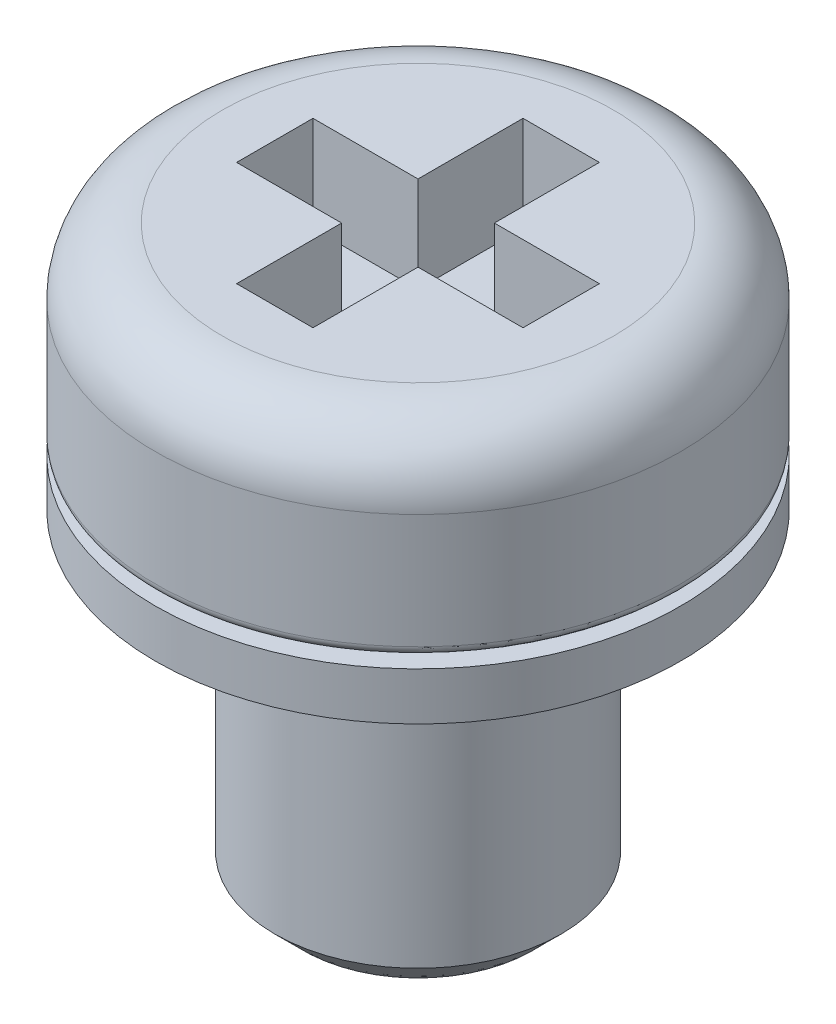
ISO-10303-21;
HEADER;
FILE_DESCRIPTION(('STEP AP214'),'2;1');
FILE_NAME('part.step','',(''),(''),'','','');
FILE_SCHEMA(('AUTOMOTIVE_DESIGN { 1 0 10303 214 1 1 1 1 }'));
ENDSEC;
DATA;
#1=APPLICATION_CONTEXT('core data for automotive mechanical design processes');
#2=APPLICATION_PROTOCOL_DEFINITION('international standard','automotive_design',2000,#1);
#3=PRODUCT_CONTEXT('',#1,'mechanical');
#4=PRODUCT('Part','Part','',(#3));
#5=PRODUCT_RELATED_PRODUCT_CATEGORY('part','',(#4));
#6=PRODUCT_DEFINITION_FORMATION('','',#4);
#7=PRODUCT_DEFINITION_CONTEXT('part definition',#1,'design');
#8=PRODUCT_DEFINITION('design','',#6,#7);
#9=PRODUCT_DEFINITION_SHAPE('','',#8);
#10=(LENGTH_UNIT() NAMED_UNIT(*) SI_UNIT(.MILLI.,.METRE.));
#11=(NAMED_UNIT(*) PLANE_ANGLE_UNIT() SI_UNIT($,.RADIAN.));
#12=(NAMED_UNIT(*) SI_UNIT($,.STERADIAN.) SOLID_ANGLE_UNIT());
#13=UNCERTAINTY_MEASURE_WITH_UNIT(LENGTH_MEASURE(1.E-05),#10,'distance_accuracy_value','');
#14=(GEOMETRIC_REPRESENTATION_CONTEXT(3) GLOBAL_UNCERTAINTY_ASSIGNED_CONTEXT((#13)) GLOBAL_UNIT_ASSIGNED_CONTEXT((#10,
#11,#12)) REPRESENTATION_CONTEXT('',''));
#15=CARTESIAN_POINT('',(0.,0.,0.));
#16=DIRECTION('',(0.,0.,1.));
#17=DIRECTION('',(1.,0.,0.));
#18=AXIS2_PLACEMENT_3D('',#15,#16,#17);
#19=CARTESIAN_POINT('',(-71.248,0.09999999999998,-43.752));
#20=DIRECTION('',(0.,1.,0.));
#21=DIRECTION('',(1.,0.,0.));
#22=AXIS2_PLACEMENT_3D('',#19,#20,#21);
#23=PLANE('',#22);
#24=CARTESIAN_POINT('',(-70.,0.0999999999758049,-45.));
#25=DIRECTION('',(0.,1.,0.));
#26=DIRECTION('',(-1.,0.,0.));
#27=AXIS2_PLACEMENT_3D('',#24,#25,#26);
#28=CIRCLE('',#27,1.19999999997188);
#29=CARTESIAN_POINT('',(-71.1999999999719,0.0999999999758049,-45.));
#30=VERTEX_POINT('',#29);
#31=EDGE_CURVE('P0_E165',#30,#30,#28,.F.);
#32=ORIENTED_EDGE('',*,*,#31,.T.);
#33=EDGE_LOOP('',(#32));
#34=FACE_BOUND('',#33,.T.);
#35=ADVANCED_FACE('P0_F17',(#34),#23,.F.);
#36=CARTESIAN_POINT('',(-70.,0.0999999999758119,-45.));
#37=DIRECTION('',(0.,1.,0.));
#38=DIRECTION('',(-1.,0.,0.));
#39=AXIS2_PLACEMENT_3D('',#36,#37,#38);
#40=CONICAL_SURFACE('',#39,1.19999999997188,0.785398163400893);
#41=CARTESIAN_POINT('',(-70.,0.400000000000003,-45.));
#42=DIRECTION('',(0.,1.,0.));
#43=DIRECTION('',(1.,0.,0.));
#44=AXIS2_PLACEMENT_3D('',#41,#42,#43);
#45=CIRCLE('',#44,1.5);
#46=CARTESIAN_POINT('',(-68.5,0.400000000000003,-45.));
#47=VERTEX_POINT('',#46);
#48=EDGE_CURVE('P0_E161',#47,#47,#45,.F.);
#49=ORIENTED_EDGE('',*,*,#48,.T.);
#50=EDGE_LOOP('',(#49));
#51=FACE_BOUND('',#50,.T.);
#52=ORIENTED_EDGE('',*,*,#31,.F.);
#53=EDGE_LOOP('',(#52));
#54=FACE_BOUND('',#53,.T.);
#55=ADVANCED_FACE('P0_F537',(#51,#54),#40,.T.);
#56=CARTESIAN_POINT('',(-70.,0.400000000000003,-45.));
#57=DIRECTION('',(0.,1.,0.));
#58=DIRECTION('',(0.,0.,1.));
#59=AXIS2_PLACEMENT_3D('',#56,#57,#58);
#60=CYLINDRICAL_SURFACE('',#59,1.5);
#61=CARTESIAN_POINT('',(-70.,3.5000000000001,-45.));
#62=DIRECTION('',(0.,1.,0.));
#63=DIRECTION('',(0.,0.,1.));
#64=AXIS2_PLACEMENT_3D('',#61,#62,#63);
#65=CIRCLE('',#64,1.5);
#66=CARTESIAN_POINT('',(-70.,3.5000000000001,-43.5));
#67=VERTEX_POINT('',#66);
#68=EDGE_CURVE('P0_E164',#67,#67,#65,.T.);
#69=ORIENTED_EDGE('',*,*,#68,.F.);
#70=EDGE_LOOP('',(#69));
#71=FACE_BOUND('',#70,.T.);
#72=ORIENTED_EDGE('',*,*,#48,.F.);
#73=EDGE_LOOP('',(#72));
#74=FACE_BOUND('',#73,.T.);
#75=ADVANCED_FACE('P0_F527',(#71,#74),#60,.T.);
#76=CARTESIAN_POINT('',(-72.86235557749,3.5,-42.14));
#77=DIRECTION('',(0.,-1.,0.));
#78=DIRECTION('',(0.,0.,-1.));
#79=AXIS2_PLACEMENT_3D('',#76,#77,#78);
#80=PLANE('',#79);
#81=ORIENTED_EDGE('',*,*,#68,.T.);
#82=EDGE_LOOP('',(#81));
#83=FACE_BOUND('',#82,.T.);
#84=CARTESIAN_POINT('',(-70.,3.4999999999996,-45.));
#85=DIRECTION('',(0.,-1.,0.));
#86=DIRECTION('',(0.,0.,-1.));
#87=AXIS2_PLACEMENT_3D('',#84,#85,#86);
#88=CIRCLE('',#87,2.75);
#89=CARTESIAN_POINT('',(-70.,3.4999999999996,-47.75));
#90=VERTEX_POINT('',#89);
#91=EDGE_CURVE('P0_E219',#90,#90,#88,.T.);
#92=ORIENTED_EDGE('',*,*,#91,.T.);
#93=EDGE_LOOP('',(#92));
#94=FACE_BOUND('',#93,.T.);
#95=ADVANCED_FACE('P0_F517',(#83,#94),#80,.T.);
#96=CARTESIAN_POINT('',(-70.,4.00000000000041,-45.));
#97=DIRECTION('',(0.,-1.,0.));
#98=DIRECTION('',(0.,0.,-1.));
#99=AXIS2_PLACEMENT_3D('',#96,#97,#98);
#100=CYLINDRICAL_SURFACE('',#99,2.75);
#101=ORIENTED_EDGE('',*,*,#91,.F.);
#102=EDGE_LOOP('',(#101));
#103=FACE_BOUND('',#102,.T.);
#104=CARTESIAN_POINT('',(-70.,4.00000000000041,-45.));
#105=DIRECTION('',(0.,-1.,0.));
#106=DIRECTION('',(0.,0.,-1.));
#107=AXIS2_PLACEMENT_3D('',#104,#105,#106);
#108=CIRCLE('',#107,2.75);
#109=CARTESIAN_POINT('',(-70.,4.00000000000041,-47.75));
#110=VERTEX_POINT('',#109);
#111=EDGE_CURVE('P0_E216',#110,#110,#108,.T.);
#112=ORIENTED_EDGE('',*,*,#111,.T.);
#113=EDGE_LOOP('',(#112));
#114=FACE_BOUND('',#113,.T.);
#115=ADVANCED_FACE('P0_F507',(#103,#114),#100,.T.);
#116=CARTESIAN_POINT('',(-72.86235557749,4.,-42.14));
#117=DIRECTION('',(0.,-1.,0.));
#118=DIRECTION('',(0.,0.,-1.));
#119=AXIS2_PLACEMENT_3D('',#116,#117,#118);
#120=PLANE('',#119);
#121=CARTESIAN_POINT('',(-70.,3.99999999999998,-45.));
#122=DIRECTION('',(0.,1.,0.));
#123=DIRECTION('',(0.,0.,1.));
#124=AXIS2_PLACEMENT_3D('',#121,#122,#123);
#125=CIRCLE('',#124,1.5);
#126=CARTESIAN_POINT('',(-70.,3.99999999999998,-43.5));
#127=VERTEX_POINT('',#126);
#128=EDGE_CURVE('P0_E143',#127,#127,#125,.F.);
#129=ORIENTED_EDGE('',*,*,#128,.T.);
#130=EDGE_LOOP('',(#129));
#131=FACE_BOUND('',#130,.T.);
#132=ORIENTED_EDGE('',*,*,#111,.F.);
#133=EDGE_LOOP('',(#132));
#134=FACE_BOUND('',#133,.T.);
#135=ADVANCED_FACE('P0_F498',(#131,#134),#120,.F.);
#136=CARTESIAN_POINT('',(-68.44,5.1,-43.44));
#137=DIRECTION('',(0.,1.,0.));
#138=DIRECTION('',(0.,0.,-1.));
#139=AXIS2_PLACEMENT_3D('',#136,#137,#138);
#140=PLANE('',#139);
#141=DIRECTION('',(-1.,0.,0.));
#142=VECTOR('',#141,1.);
#143=CARTESIAN_POINT('',(-70.95,5.1,-45.4));
#144=LINE('',#143,#142);
#145=CARTESIAN_POINT('',(-70.4,5.1,-45.4));
#146=VERTEX_POINT('',#145);
#147=CARTESIAN_POINT('',(-71.5,5.1,-45.4));
#148=VERTEX_POINT('',#147);
#149=EDGE_CURVE('P0_E150',#146,#148,#144,.T.);
#150=ORIENTED_EDGE('',*,*,#149,.T.);
#151=DIRECTION('',(0.,0.,1.));
#152=VECTOR('',#151,1.);
#153=CARTESIAN_POINT('',(-71.5,5.1,-45.));
#154=LINE('',#153,#152);
#155=CARTESIAN_POINT('',(-71.5,5.1,-44.6));
#156=VERTEX_POINT('',#155);
#157=EDGE_CURVE('P0_E142',#148,#156,#154,.T.);
#158=ORIENTED_EDGE('',*,*,#157,.T.);
#159=DIRECTION('',(1.,0.,0.));
#160=VECTOR('',#159,1.);
#161=CARTESIAN_POINT('',(-70.95,5.1,-44.6));
#162=LINE('',#161,#160);
#163=CARTESIAN_POINT('',(-70.4,5.1,-44.6));
#164=VERTEX_POINT('',#163);
#165=EDGE_CURVE('P0_E131',#156,#164,#162,.T.);
#166=ORIENTED_EDGE('',*,*,#165,.T.);
#167=DIRECTION('',(0.,0.,1.));
#168=VECTOR('',#167,1.);
#169=CARTESIAN_POINT('',(-70.4,5.1,-44.05));
#170=LINE('',#169,#168);
#171=CARTESIAN_POINT('',(-70.4,5.1,-43.5));
#172=VERTEX_POINT('',#171);
#173=EDGE_CURVE('P0_E290',#164,#172,#170,.T.);
#174=ORIENTED_EDGE('',*,*,#173,.T.);
#175=DIRECTION('',(1.,0.,0.));
#176=VECTOR('',#175,1.);
#177=CARTESIAN_POINT('',(-70.,5.1,-43.5));
#178=LINE('',#177,#176);
#179=CARTESIAN_POINT('',(-69.6,5.1,-43.5));
#180=VERTEX_POINT('',#179);
#181=EDGE_CURVE('P0_E296',#172,#180,#178,.T.);
#182=ORIENTED_EDGE('',*,*,#181,.T.);
#183=DIRECTION('',(0.,0.,-1.));
#184=VECTOR('',#183,1.);
#185=CARTESIAN_POINT('',(-69.6,5.1,-44.05));
#186=LINE('',#185,#184);
#187=CARTESIAN_POINT('',(-69.6,5.1,-44.6));
#188=VERTEX_POINT('',#187);
#189=EDGE_CURVE('P0_E302',#180,#188,#186,.T.);
#190=ORIENTED_EDGE('',*,*,#189,.T.);
#191=DIRECTION('',(1.,0.,0.));
#192=VECTOR('',#191,1.);
#193=CARTESIAN_POINT('',(-69.05,5.1,-44.6));
#194=LINE('',#193,#192);
#195=CARTESIAN_POINT('',(-68.5,5.1,-44.6));
#196=VERTEX_POINT('',#195);
#197=EDGE_CURVE('P0_E308',#188,#196,#194,.T.);
#198=ORIENTED_EDGE('',*,*,#197,.T.);
#199=DIRECTION('',(0.,0.,-1.));
#200=VECTOR('',#199,1.);
#201=CARTESIAN_POINT('',(-68.5,5.1,-45.));
#202=LINE('',#201,#200);
#203=CARTESIAN_POINT('',(-68.5,5.1,-45.4));
#204=VERTEX_POINT('',#203);
#205=EDGE_CURVE('P0_E314',#196,#204,#202,.T.);
#206=ORIENTED_EDGE('',*,*,#205,.T.);
#207=DIRECTION('',(-1.,0.,0.));
#208=VECTOR('',#207,1.);
#209=CARTESIAN_POINT('',(-69.05,5.1,-45.4));
#210=LINE('',#209,#208);
#211=CARTESIAN_POINT('',(-69.6,5.1,-45.4));
#212=VERTEX_POINT('',#211);
#213=EDGE_CURVE('P0_E320',#204,#212,#210,.T.);
#214=ORIENTED_EDGE('',*,*,#213,.T.);
#215=DIRECTION('',(0.,0.,-1.));
#216=VECTOR('',#215,1.);
#217=CARTESIAN_POINT('',(-69.6,5.1,-45.95));
#218=LINE('',#217,#216);
#219=CARTESIAN_POINT('',(-69.6,5.1,-46.5));
#220=VERTEX_POINT('',#219);
#221=EDGE_CURVE('P0_E326',#212,#220,#218,.T.);
#222=ORIENTED_EDGE('',*,*,#221,.T.);
#223=DIRECTION('',(-1.,0.,0.));
#224=VECTOR('',#223,1.);
#225=CARTESIAN_POINT('',(-70.,5.1,-46.5));
#226=LINE('',#225,#224);
#227=CARTESIAN_POINT('',(-70.4,5.1,-46.5));
#228=VERTEX_POINT('',#227);
#229=EDGE_CURVE('P0_E332',#220,#228,#226,.T.);
#230=ORIENTED_EDGE('',*,*,#229,.T.);
#231=DIRECTION('',(0.,0.,1.));
#232=VECTOR('',#231,1.);
#233=CARTESIAN_POINT('',(-70.4,5.1,-45.95));
#234=LINE('',#233,#232);
#235=EDGE_CURVE('P0_E338',#228,#146,#234,.T.);
#236=ORIENTED_EDGE('',*,*,#235,.T.);
#237=EDGE_LOOP('',(#150,#158,#166,#174,#182,#190,#198,#206,#214,#222,#230,#236));
#238=FACE_BOUND('',#237,.T.);
#239=ADVANCED_FACE('P0_F153',(#238),#140,.T.);
#240=CARTESIAN_POINT('',(-70.,3.99999999999998,-45.));
#241=DIRECTION('',(0.,1.,0.));
#242=DIRECTION('',(0.,0.,1.));
#243=AXIS2_PLACEMENT_3D('',#240,#241,#242);
#244=CYLINDRICAL_SURFACE('',#243,1.5);
#245=CARTESIAN_POINT('',(-70.,4.09999999999988,-45.));
#246=DIRECTION('',(0.,1.,0.));
#247=DIRECTION('',(0.,0.,1.));
#248=AXIS2_PLACEMENT_3D('',#245,#246,#247);
#249=CIRCLE('',#248,1.5);
#250=CARTESIAN_POINT('',(-70.,4.09999999999988,-43.5));
#251=VERTEX_POINT('',#250);
#252=EDGE_CURVE('P0_E206',#251,#251,#249,.F.);
#253=ORIENTED_EDGE('',*,*,#252,.T.);
#254=EDGE_LOOP('',(#253));
#255=FACE_BOUND('',#254,.T.);
#256=ORIENTED_EDGE('',*,*,#128,.F.);
#257=EDGE_LOOP('',(#256));
#258=FACE_BOUND('',#257,.T.);
#259=ADVANCED_FACE('P0_F481',(#255,#258),#244,.T.);
#260=CARTESIAN_POINT('',(-71.522,5.08,-44.6));
#261=DIRECTION('',(0.,0.,1.));
#262=DIRECTION('',(1.,0.,0.));
#263=AXIS2_PLACEMENT_3D('',#260,#261,#262);
#264=PLANE('',#263);
#265=ORIENTED_EDGE('',*,*,#165,.F.);
#266=DIRECTION('',(0.,1.,0.));
#267=VECTOR('',#266,1.);
#268=CARTESIAN_POINT('',(-71.5,5.6,-44.6));
#269=LINE('',#268,#267);
#270=CARTESIAN_POINT('',(-71.5,6.1,-44.6));
#271=VERTEX_POINT('',#270);
#272=EDGE_CURVE('P0_E135',#156,#271,#269,.T.);
#273=ORIENTED_EDGE('',*,*,#272,.T.);
#274=DIRECTION('',(-1.,0.,0.));
#275=VECTOR('',#274,1.);
#276=CARTESIAN_POINT('',(-70.,6.1,-44.6));
#277=LINE('',#276,#275);
#278=CARTESIAN_POINT('',(-70.4,6.1,-44.6));
#279=VERTEX_POINT('',#278);
#280=EDGE_CURVE('P0_E269',#279,#271,#277,.T.);
#281=ORIENTED_EDGE('',*,*,#280,.F.);
#282=DIRECTION('',(0.,-1.,0.));
#283=VECTOR('',#282,1.);
#284=CARTESIAN_POINT('',(-70.4,5.6,-44.6));
#285=LINE('',#284,#283);
#286=EDGE_CURVE('P0_E137',#279,#164,#285,.T.);
#287=ORIENTED_EDGE('',*,*,#286,.T.);
#288=EDGE_LOOP('',(#265,#273,#281,#287));
#289=FACE_BOUND('',#288,.T.);
#290=ADVANCED_FACE('P0_F133',(#289),#264,.F.);
#291=CARTESIAN_POINT('',(-71.5,5.08,-45.416));
#292=DIRECTION('',(-1.,0.,0.));
#293=DIRECTION('',(0.,0.,1.));
#294=AXIS2_PLACEMENT_3D('',#291,#292,#293);
#295=PLANE('',#294);
#296=ORIENTED_EDGE('',*,*,#157,.F.);
#297=DIRECTION('',(0.,1.,0.));
#298=VECTOR('',#297,1.);
#299=CARTESIAN_POINT('',(-71.5,5.6,-45.4));
#300=LINE('',#299,#298);
#301=CARTESIAN_POINT('',(-71.5,6.1,-45.4));
#302=VERTEX_POINT('',#301);
#303=EDGE_CURVE('P0_E340',#148,#302,#300,.T.);
#304=ORIENTED_EDGE('',*,*,#303,.T.);
#305=DIRECTION('',(0.,0.,-1.));
#306=VECTOR('',#305,1.);
#307=CARTESIAN_POINT('',(-71.5,6.1,-45.));
#308=LINE('',#307,#306);
#309=EDGE_CURVE('P0_E149',#271,#302,#308,.T.);
#310=ORIENTED_EDGE('',*,*,#309,.F.);
#311=ORIENTED_EDGE('',*,*,#272,.F.);
#312=EDGE_LOOP('',(#296,#304,#310,#311));
#313=FACE_BOUND('',#312,.T.);
#314=ADVANCED_FACE('P0_F146',(#313),#295,.F.);
#315=CARTESIAN_POINT('',(-70.378,5.08,-45.4));
#316=DIRECTION('',(0.,0.,-1.));
#317=DIRECTION('',(-1.,0.,0.));
#318=AXIS2_PLACEMENT_3D('',#315,#316,#317);
#319=PLANE('',#318);
#320=ORIENTED_EDGE('',*,*,#149,.F.);
#321=DIRECTION('',(0.,1.,0.));
#322=VECTOR('',#321,1.);
#323=CARTESIAN_POINT('',(-70.4,5.6,-45.4));
#324=LINE('',#323,#322);
#325=CARTESIAN_POINT('',(-70.4,6.1,-45.4));
#326=VERTEX_POINT('',#325);
#327=EDGE_CURVE('P0_E335',#146,#326,#324,.T.);
#328=ORIENTED_EDGE('',*,*,#327,.T.);
#329=DIRECTION('',(1.,0.,0.));
#330=VECTOR('',#329,1.);
#331=CARTESIAN_POINT('',(-70.,6.1,-45.4));
#332=LINE('',#331,#330);
#333=EDGE_CURVE('P0_E266',#302,#326,#332,.T.);
#334=ORIENTED_EDGE('',*,*,#333,.F.);
#335=ORIENTED_EDGE('',*,*,#303,.F.);
#336=EDGE_LOOP('',(#320,#328,#334,#335));
#337=FACE_BOUND('',#336,.T.);
#338=ADVANCED_FACE('P0_F343',(#337),#319,.F.);
#339=CARTESIAN_POINT('',(-70.4,5.08,-46.522));
#340=DIRECTION('',(-1.,0.,0.));
#341=DIRECTION('',(0.,0.,1.));
#342=AXIS2_PLACEMENT_3D('',#339,#340,#341);
#343=PLANE('',#342);
#344=ORIENTED_EDGE('',*,*,#235,.F.);
#345=DIRECTION('',(0.,1.,0.));
#346=VECTOR('',#345,1.);
#347=CARTESIAN_POINT('',(-70.4,5.6,-46.5));
#348=LINE('',#347,#346);
#349=CARTESIAN_POINT('',(-70.4,6.1,-46.5));
#350=VERTEX_POINT('',#349);
#351=EDGE_CURVE('P0_E329',#228,#350,#348,.T.);
#352=ORIENTED_EDGE('',*,*,#351,.T.);
#353=DIRECTION('',(0.,0.,-1.));
#354=VECTOR('',#353,1.);
#355=CARTESIAN_POINT('',(-70.4,6.1,-45.));
#356=LINE('',#355,#354);
#357=EDGE_CURVE('P0_E264',#326,#350,#356,.T.);
#358=ORIENTED_EDGE('',*,*,#357,.F.);
#359=ORIENTED_EDGE('',*,*,#327,.F.);
#360=EDGE_LOOP('',(#344,#352,#358,#359));
#361=FACE_BOUND('',#360,.T.);
#362=ADVANCED_FACE('P0_F377',(#361),#343,.F.);
#363=CARTESIAN_POINT('',(-69.584,5.08,-46.5));
#364=DIRECTION('',(0.,0.,-1.));
#365=DIRECTION('',(-1.,0.,0.));
#366=AXIS2_PLACEMENT_3D('',#363,#364,#365);
#367=PLANE('',#366);
#368=ORIENTED_EDGE('',*,*,#229,.F.);
#369=DIRECTION('',(0.,1.,0.));
#370=VECTOR('',#369,1.);
#371=CARTESIAN_POINT('',(-69.6,5.6,-46.5));
#372=LINE('',#371,#370);
#373=CARTESIAN_POINT('',(-69.6,6.1,-46.5));
#374=VERTEX_POINT('',#373);
#375=EDGE_CURVE('P0_E323',#220,#374,#372,.T.);
#376=ORIENTED_EDGE('',*,*,#375,.T.);
#377=DIRECTION('',(1.,0.,0.));
#378=VECTOR('',#377,1.);
#379=CARTESIAN_POINT('',(-70.,6.1,-46.5));
#380=LINE('',#379,#378);
#381=EDGE_CURVE('P0_E262',#350,#374,#380,.T.);
#382=ORIENTED_EDGE('',*,*,#381,.F.);
#383=ORIENTED_EDGE('',*,*,#351,.F.);
#384=EDGE_LOOP('',(#368,#376,#382,#383));
#385=FACE_BOUND('',#384,.T.);
#386=ADVANCED_FACE('P0_F374',(#385),#367,.F.);
#387=CARTESIAN_POINT('',(-69.6,5.08,-45.378));
#388=DIRECTION('',(1.,0.,0.));
#389=DIRECTION('',(0.,0.,-1.));
#390=AXIS2_PLACEMENT_3D('',#387,#388,#389);
#391=PLANE('',#390);
#392=ORIENTED_EDGE('',*,*,#221,.F.);
#393=DIRECTION('',(0.,1.,0.));
#394=VECTOR('',#393,1.);
#395=CARTESIAN_POINT('',(-69.6,5.6,-45.4));
#396=LINE('',#395,#394);
#397=CARTESIAN_POINT('',(-69.6,6.1,-45.4));
#398=VERTEX_POINT('',#397);
#399=EDGE_CURVE('P0_E317',#212,#398,#396,.T.);
#400=ORIENTED_EDGE('',*,*,#399,.T.);
#401=DIRECTION('',(0.,0.,1.));
#402=VECTOR('',#401,1.);
#403=CARTESIAN_POINT('',(-69.6,6.1,-45.));
#404=LINE('',#403,#402);
#405=EDGE_CURVE('P0_E260',#374,#398,#404,.T.);
#406=ORIENTED_EDGE('',*,*,#405,.F.);
#407=ORIENTED_EDGE('',*,*,#375,.F.);
#408=EDGE_LOOP('',(#392,#400,#406,#407));
#409=FACE_BOUND('',#408,.T.);
#410=ADVANCED_FACE('P0_F370',(#409),#391,.F.);
#411=CARTESIAN_POINT('',(-68.478,5.08,-45.4));
#412=DIRECTION('',(0.,0.,-1.));
#413=DIRECTION('',(-1.,0.,0.));
#414=AXIS2_PLACEMENT_3D('',#411,#412,#413);
#415=PLANE('',#414);
#416=ORIENTED_EDGE('',*,*,#213,.F.);
#417=DIRECTION('',(0.,1.,0.));
#418=VECTOR('',#417,1.);
#419=CARTESIAN_POINT('',(-68.5,5.6,-45.4));
#420=LINE('',#419,#418);
#421=CARTESIAN_POINT('',(-68.5,6.1,-45.4));
#422=VERTEX_POINT('',#421);
#423=EDGE_CURVE('P0_E311',#204,#422,#420,.T.);
#424=ORIENTED_EDGE('',*,*,#423,.T.);
#425=DIRECTION('',(1.,0.,0.));
#426=VECTOR('',#425,1.);
#427=CARTESIAN_POINT('',(-70.,6.1,-45.4));
#428=LINE('',#427,#426);
#429=EDGE_CURVE('P0_E258',#398,#422,#428,.T.);
#430=ORIENTED_EDGE('',*,*,#429,.F.);
#431=ORIENTED_EDGE('',*,*,#399,.F.);
#432=EDGE_LOOP('',(#416,#424,#430,#431));
#433=FACE_BOUND('',#432,.T.);
#434=ADVANCED_FACE('P0_F366',(#433),#415,.F.);
#435=CARTESIAN_POINT('',(-68.5,5.08,-44.584));
#436=DIRECTION('',(1.,0.,0.));
#437=DIRECTION('',(0.,0.,-1.));
#438=AXIS2_PLACEMENT_3D('',#435,#436,#437);
#439=PLANE('',#438);
#440=ORIENTED_EDGE('',*,*,#205,.F.);
#441=DIRECTION('',(0.,1.,0.));
#442=VECTOR('',#441,1.);
#443=CARTESIAN_POINT('',(-68.5,5.6,-44.6));
#444=LINE('',#443,#442);
#445=CARTESIAN_POINT('',(-68.5,6.1,-44.6));
#446=VERTEX_POINT('',#445);
#447=EDGE_CURVE('P0_E305',#196,#446,#444,.T.);
#448=ORIENTED_EDGE('',*,*,#447,.T.);
#449=DIRECTION('',(0.,0.,1.));
#450=VECTOR('',#449,1.);
#451=CARTESIAN_POINT('',(-68.5,6.1,-45.));
#452=LINE('',#451,#450);
#453=EDGE_CURVE('P0_E256',#422,#446,#452,.T.);
#454=ORIENTED_EDGE('',*,*,#453,.F.);
#455=ORIENTED_EDGE('',*,*,#423,.F.);
#456=EDGE_LOOP('',(#440,#448,#454,#455));
#457=FACE_BOUND('',#456,.T.);
#458=ADVANCED_FACE('P0_F362',(#457),#439,.F.);
#459=CARTESIAN_POINT('',(-69.622,5.08,-44.6));
#460=DIRECTION('',(0.,0.,1.));
#461=DIRECTION('',(1.,0.,0.));
#462=AXIS2_PLACEMENT_3D('',#459,#460,#461);
#463=PLANE('',#462);
#464=ORIENTED_EDGE('',*,*,#197,.F.);
#465=DIRECTION('',(0.,1.,0.));
#466=VECTOR('',#465,1.);
#467=CARTESIAN_POINT('',(-69.6,5.6,-44.6));
#468=LINE('',#467,#466);
#469=CARTESIAN_POINT('',(-69.6,6.1,-44.6));
#470=VERTEX_POINT('',#469);
#471=EDGE_CURVE('P0_E299',#188,#470,#468,.T.);
#472=ORIENTED_EDGE('',*,*,#471,.T.);
#473=DIRECTION('',(-1.,0.,0.));
#474=VECTOR('',#473,1.);
#475=CARTESIAN_POINT('',(-70.,6.1,-44.6));
#476=LINE('',#475,#474);
#477=EDGE_CURVE('P0_E254',#446,#470,#476,.T.);
#478=ORIENTED_EDGE('',*,*,#477,.F.);
#479=ORIENTED_EDGE('',*,*,#447,.F.);
#480=EDGE_LOOP('',(#464,#472,#478,#479));
#481=FACE_BOUND('',#480,.T.);
#482=ADVANCED_FACE('P0_F358',(#481),#463,.F.);
#483=CARTESIAN_POINT('',(-69.6,5.08,-43.478));
#484=DIRECTION('',(1.,0.,0.));
#485=DIRECTION('',(0.,0.,-1.));
#486=AXIS2_PLACEMENT_3D('',#483,#484,#485);
#487=PLANE('',#486);
#488=ORIENTED_EDGE('',*,*,#189,.F.);
#489=DIRECTION('',(0.,1.,0.));
#490=VECTOR('',#489,1.);
#491=CARTESIAN_POINT('',(-69.6,5.6,-43.5));
#492=LINE('',#491,#490);
#493=CARTESIAN_POINT('',(-69.6,6.1,-43.5));
#494=VERTEX_POINT('',#493);
#495=EDGE_CURVE('P0_E293',#180,#494,#492,.T.);
#496=ORIENTED_EDGE('',*,*,#495,.T.);
#497=DIRECTION('',(0.,0.,1.));
#498=VECTOR('',#497,1.);
#499=CARTESIAN_POINT('',(-69.6,6.1,-45.));
#500=LINE('',#499,#498);
#501=EDGE_CURVE('P0_E252',#470,#494,#500,.T.);
#502=ORIENTED_EDGE('',*,*,#501,.F.);
#503=ORIENTED_EDGE('',*,*,#471,.F.);
#504=EDGE_LOOP('',(#488,#496,#502,#503));
#505=FACE_BOUND('',#504,.T.);
#506=ADVANCED_FACE('P0_F354',(#505),#487,.F.);
#507=CARTESIAN_POINT('',(-70.416,5.08,-43.5));
#508=DIRECTION('',(0.,0.,1.));
#509=DIRECTION('',(1.,0.,0.));
#510=AXIS2_PLACEMENT_3D('',#507,#508,#509);
#511=PLANE('',#510);
#512=ORIENTED_EDGE('',*,*,#181,.F.);
#513=DIRECTION('',(0.,1.,0.));
#514=VECTOR('',#513,1.);
#515=CARTESIAN_POINT('',(-70.4,5.6,-43.5));
#516=LINE('',#515,#514);
#517=CARTESIAN_POINT('',(-70.4,6.1,-43.5));
#518=VERTEX_POINT('',#517);
#519=EDGE_CURVE('P0_E283',#172,#518,#516,.T.);
#520=ORIENTED_EDGE('',*,*,#519,.T.);
#521=DIRECTION('',(-1.,0.,0.));
#522=VECTOR('',#521,1.);
#523=CARTESIAN_POINT('',(-70.,6.1,-43.5));
#524=LINE('',#523,#522);
#525=EDGE_CURVE('P0_E60',#494,#518,#524,.T.);
#526=ORIENTED_EDGE('',*,*,#525,.F.);
#527=ORIENTED_EDGE('',*,*,#495,.F.);
#528=EDGE_LOOP('',(#512,#520,#526,#527));
#529=FACE_BOUND('',#528,.T.);
#530=ADVANCED_FACE('P0_F351',(#529),#511,.F.);
#531=CARTESIAN_POINT('',(-70.4,5.08,-44.622));
#532=DIRECTION('',(-1.,0.,0.));
#533=DIRECTION('',(0.,0.,1.));
#534=AXIS2_PLACEMENT_3D('',#531,#532,#533);
#535=PLANE('',#534);
#536=ORIENTED_EDGE('',*,*,#173,.F.);
#537=ORIENTED_EDGE('',*,*,#286,.F.);
#538=DIRECTION('',(0.,0.,-1.));
#539=VECTOR('',#538,1.);
#540=CARTESIAN_POINT('',(-70.4,6.1,-45.));
#541=LINE('',#540,#539);
#542=EDGE_CURVE('P0_E249',#518,#279,#541,.T.);
#543=ORIENTED_EDGE('',*,*,#542,.F.);
#544=ORIENTED_EDGE('',*,*,#519,.F.);
#545=EDGE_LOOP('',(#536,#537,#543,#544));
#546=FACE_BOUND('',#545,.T.);
#547=ADVANCED_FACE('P0_F180',(#546),#535,.F.);
#548=CARTESIAN_POINT('',(-72.756,4.1,-42.244));
#549=DIRECTION('',(0.,1.,0.));
#550=DIRECTION('',(1.,0.,0.));
#551=AXIS2_PLACEMENT_3D('',#548,#549,#550);
#552=PLANE('',#551);
#553=ORIENTED_EDGE('',*,*,#252,.F.);
#554=EDGE_LOOP('',(#553));
#555=FACE_BOUND('',#554,.T.);
#556=CARTESIAN_POINT('',(-70.,4.1,-45.));
#557=DIRECTION('',(0.,1.,0.));
#558=DIRECTION('',(-1.,0.,2.29114421355762E-12));
#559=AXIS2_PLACEMENT_3D('',#556,#557,#558);
#560=CIRCLE('',#559,2.64999999999613);
#561=CARTESIAN_POINT('',(-67.3500000000023,4.1,-45.0000000000036));
#562=VERTEX_POINT('',#561);
#563=CARTESIAN_POINT('',(-72.6499999999977,4.1,-44.9999999999964));
#564=VERTEX_POINT('',#563);
#565=EDGE_CURVE('P0_E167',#562,#564,#560,.F.);
#566=ORIENTED_EDGE('',*,*,#565,.T.);
#567=CARTESIAN_POINT('',(-70.,4.1,-45.));
#568=DIRECTION('',(0.,1.,0.));
#569=DIRECTION('',(1.,0.,-2.28852576302785E-12));
#570=AXIS2_PLACEMENT_3D('',#567,#568,#569);
#571=CIRCLE('',#570,2.64999999999611);
#572=EDGE_CURVE('P0_E48',#562,#564,#571,.T.);
#573=ORIENTED_EDGE('',*,*,#572,.F.);
#574=EDGE_LOOP('',(#566,#573));
#575=FACE_BOUND('',#574,.T.);
#576=ADVANCED_FACE('P0_F171',(#555,#575),#552,.F.);
#577=CARTESIAN_POINT('',(-72.132,6.1,-42.868));
#578=DIRECTION('',(0.,1.,0.));
#579=DIRECTION('',(1.,0.,0.));
#580=AXIS2_PLACEMENT_3D('',#577,#578,#579);
#581=PLANE('',#580);
#582=ORIENTED_EDGE('',*,*,#525,.T.);
#583=ORIENTED_EDGE('',*,*,#542,.T.);
#584=ORIENTED_EDGE('',*,*,#280,.T.);
#585=ORIENTED_EDGE('',*,*,#309,.T.);
#586=ORIENTED_EDGE('',*,*,#333,.T.);
#587=ORIENTED_EDGE('',*,*,#357,.T.);
#588=ORIENTED_EDGE('',*,*,#381,.T.);
#589=ORIENTED_EDGE('',*,*,#405,.T.);
#590=ORIENTED_EDGE('',*,*,#429,.T.);
#591=ORIENTED_EDGE('',*,*,#453,.T.);
#592=ORIENTED_EDGE('',*,*,#477,.T.);
#593=ORIENTED_EDGE('',*,*,#501,.T.);
#594=EDGE_LOOP('',(#582,#583,#584,#585,#586,#587,#588,#589,#590,#591,#592,#593));
#595=FACE_BOUND('',#594,.T.);
#596=CARTESIAN_POINT('',(-70.,6.1,-45.));
#597=DIRECTION('',(0.,-1.,0.));
#598=DIRECTION('',(-1.,0.,4.70490854948042E-13));
#599=AXIS2_PLACEMENT_3D('',#596,#597,#598);
#600=CIRCLE('',#599,2.04999999999919);
#601=CARTESIAN_POINT('',(-67.9500000000005,6.1,-45.0000000000006));
#602=VERTEX_POINT('',#601);
#603=CARTESIAN_POINT('',(-72.0499999999995,6.1,-44.9999999999994));
#604=VERTEX_POINT('',#603);
#605=EDGE_CURVE('P0_E38',#602,#604,#600,.F.);
#606=ORIENTED_EDGE('',*,*,#605,.T.);
#607=CARTESIAN_POINT('',(-70.,6.1,-45.));
#608=DIRECTION('',(0.,-1.,0.));
#609=DIRECTION('',(1.,0.,-4.70490854948042E-13));
#610=AXIS2_PLACEMENT_3D('',#607,#608,#609);
#611=CIRCLE('',#610,2.04999999999919);
#612=EDGE_CURVE('P0_E160',#604,#602,#611,.F.);
#613=ORIENTED_EDGE('',*,*,#612,.T.);
#614=EDGE_LOOP('',(#606,#613));
#615=FACE_BOUND('',#614,.T.);
#616=ADVANCED_FACE('P0_F19',(#595,#615),#581,.T.);
#617=CARTESIAN_POINT('',(-70.,4.2,-45.));
#618=DIRECTION('',(0.,1.,0.));
#619=DIRECTION('',(0.999969531212782,0.,-0.00780619280378656));
#620=AXIS2_PLACEMENT_3D('',#617,#618,#619);
#621=TOROIDAL_SURFACE('',#620,2.64999999999614,0.1);
#622=CARTESIAN_POINT('',(-70.,4.2,-45.));
#623=DIRECTION('',(0.,1.,0.));
#624=DIRECTION('',(1.,0.,0.));
#625=AXIS2_PLACEMENT_3D('',#622,#623,#624);
#626=CIRCLE('',#625,2.75000000000002);
#627=CARTESIAN_POINT('',(-67.25,4.2,-45.));
#628=VERTEX_POINT('',#627);
#629=EDGE_CURVE('P0_E30',#628,#628,#626,.F.);
#630=ORIENTED_EDGE('',*,*,#629,.T.);
#631=EDGE_LOOP('',(#630));
#632=FACE_BOUND('',#631,.T.);
#633=ORIENTED_EDGE('',*,*,#565,.F.);
#634=ORIENTED_EDGE('',*,*,#572,.T.);
#635=EDGE_LOOP('',(#633,#634));
#636=FACE_BOUND('',#635,.T.);
#637=ADVANCED_FACE('P0_F240',(#632,#636),#621,.T.);
#638=CARTESIAN_POINT('',(-70.,5.4,-45.));
#639=DIRECTION('',(0.,1.,0.));
#640=DIRECTION('',(0.999986040741819,0.,-0.00528377909269084));
#641=AXIS2_PLACEMENT_3D('',#638,#639,#640);
#642=TOROIDAL_SURFACE('',#641,2.04999999999928,0.7);
#643=ORIENTED_EDGE('',*,*,#605,.F.);
#644=ORIENTED_EDGE('',*,*,#612,.F.);
#645=EDGE_LOOP('',(#643,#644));
#646=FACE_BOUND('',#645,.T.);
#647=CARTESIAN_POINT('',(-70.,5.39999999999996,-45.));
#648=DIRECTION('',(0.,1.,0.));
#649=DIRECTION('',(1.,0.,0.));
#650=AXIS2_PLACEMENT_3D('',#647,#648,#649);
#651=CIRCLE('',#650,2.75);
#652=CARTESIAN_POINT('',(-67.25,5.39999999999996,-45.));
#653=VERTEX_POINT('',#652);
#654=EDGE_CURVE('P0_E11',#653,#653,#651,.T.);
#655=ORIENTED_EDGE('',*,*,#654,.T.);
#656=EDGE_LOOP('',(#655));
#657=FACE_BOUND('',#656,.T.);
#658=ADVANCED_FACE('P0_F229',(#646,#657),#642,.T.);
#659=CARTESIAN_POINT('',(-70.,4.2,-45.));
#660=DIRECTION('',(0.,1.,0.));
#661=DIRECTION('',(0.,0.,1.));
#662=AXIS2_PLACEMENT_3D('',#659,#660,#661);
#663=CYLINDRICAL_SURFACE('',#662,2.75);
#664=ORIENTED_EDGE('',*,*,#654,.F.);
#665=EDGE_LOOP('',(#664));
#666=FACE_BOUND('',#665,.T.);
#667=ORIENTED_EDGE('',*,*,#629,.F.);
#668=EDGE_LOOP('',(#667));
#669=FACE_BOUND('',#668,.T.);
#670=ADVANCED_FACE('P0_F239',(#666,#669),#663,.T.);
#671=CLOSED_SHELL('',(#35,#55,#75,#95,#115,#135,#239,#259,#290,#314,#338,#362,#386,#410,#434,
#458,#482,#506,#530,#547,#576,#616,#637,#658,#670));
#672=MANIFOLD_SOLID_BREP('P0_B1',#671);
#673=CARTESIAN_POINT('',(-70.,0.149999999999984,-45.));
#674=DIRECTION('',(0.,1.,0.));
#675=DIRECTION('',(0.,0.,1.));
#676=AXIS2_PLACEMENT_3D('',#673,#674,#675);
#677=CYLINDRICAL_SURFACE('',#676,1.24999999999999);
#678=CARTESIAN_POINT('',(-70.,4.09999999999987,-45.));
#679=DIRECTION('',(0.,1.,0.));
#680=DIRECTION('',(-1.,0.,0.));
#681=AXIS2_PLACEMENT_3D('',#678,#679,#680);
#682=CIRCLE('',#681,1.24999999999999);
#683=CARTESIAN_POINT('',(-71.25,4.09999999999987,-45.));
#684=VERTEX_POINT('',#683);
#685=EDGE_CURVE('P1_E10',#684,#684,#682,.T.);
#686=ORIENTED_EDGE('',*,*,#685,.T.);
#687=EDGE_LOOP('',(#686));
#688=FACE_BOUND('',#687,.T.);
#689=CARTESIAN_POINT('',(-70.,0.149999999999984,-45.));
#690=DIRECTION('',(0.,1.,0.));
#691=DIRECTION('',(-1.,0.,0.));
#692=AXIS2_PLACEMENT_3D('',#689,#690,#691);
#693=CIRCLE('',#692,1.24999999999999);
#694=CARTESIAN_POINT('',(-71.25,0.149999999999984,-45.));
#695=VERTEX_POINT('',#694);
#696=EDGE_CURVE('P1_E16',#695,#695,#693,.F.);
#697=ORIENTED_EDGE('',*,*,#696,.T.);
#698=EDGE_LOOP('',(#697));
#699=FACE_BOUND('',#698,.T.);
#700=ADVANCED_FACE('P1_F15',(#688,#699),#677,.F.);
#701=OPEN_SHELL('',(#700));
#702=SHELL_BASED_SURFACE_MODEL('P1_B1',(#701));
#703=ADVANCED_BREP_SHAPE_REPRESENTATION('',(#18,#672),#14);
#704=MANIFOLD_SURFACE_SHAPE_REPRESENTATION('',(#18,#702),#14);
#705=SHAPE_REPRESENTATION('',(#18),#14);
#706=SHAPE_DEFINITION_REPRESENTATION(#9,#705);
#707=SHAPE_REPRESENTATION_RELATIONSHIP('','',#705,#703);
#708=SHAPE_REPRESENTATION_RELATIONSHIP('','',#705,#704);
ENDSEC;
END-ISO-10303-21;
